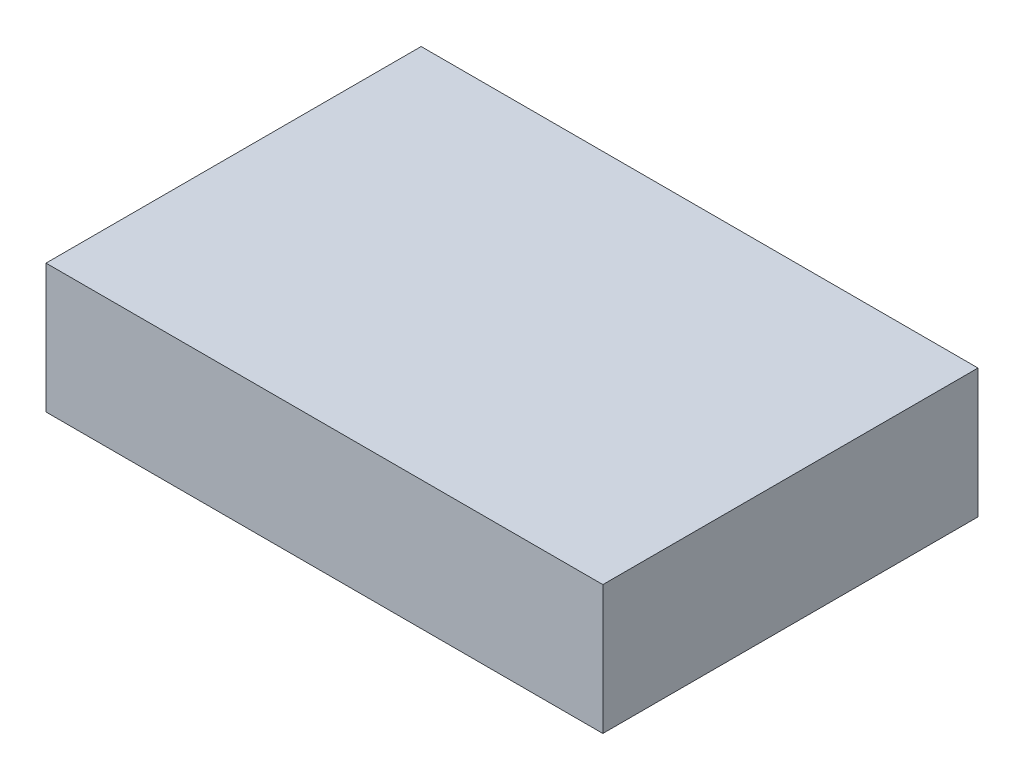
ISO-10303-21;
HEADER;
FILE_DESCRIPTION(('STEP AP214'),'2;1');
FILE_NAME('part.step','',(''),(''),'','','');
FILE_SCHEMA(('AUTOMOTIVE_DESIGN { 1 0 10303 214 1 1 1 1 }'));
ENDSEC;
DATA;
#1=APPLICATION_CONTEXT('core data for automotive mechanical design processes');
#2=APPLICATION_PROTOCOL_DEFINITION('international standard','automotive_design',2000,#1);
#3=PRODUCT_CONTEXT('',#1,'mechanical');
#4=PRODUCT('Part','Part','',(#3));
#5=PRODUCT_RELATED_PRODUCT_CATEGORY('part','',(#4));
#6=PRODUCT_DEFINITION_FORMATION('','',#4);
#7=PRODUCT_DEFINITION_CONTEXT('part definition',#1,'design');
#8=PRODUCT_DEFINITION('design','',#6,#7);
#9=PRODUCT_DEFINITION_SHAPE('','',#8);
#10=(LENGTH_UNIT() NAMED_UNIT(*) SI_UNIT(.MILLI.,.METRE.));
#11=(NAMED_UNIT(*) PLANE_ANGLE_UNIT() SI_UNIT($,.RADIAN.));
#12=(NAMED_UNIT(*) SI_UNIT($,.STERADIAN.) SOLID_ANGLE_UNIT());
#13=UNCERTAINTY_MEASURE_WITH_UNIT(LENGTH_MEASURE(1.E-05),#10,'distance_accuracy_value','');
#14=(GEOMETRIC_REPRESENTATION_CONTEXT(3) GLOBAL_UNCERTAINTY_ASSIGNED_CONTEXT((#13)) GLOBAL_UNIT_ASSIGNED_CONTEXT((#10,
#11,#12)) REPRESENTATION_CONTEXT('',''));
#15=CARTESIAN_POINT('',(0.,0.,0.));
#16=DIRECTION('',(0.,0.,1.));
#17=DIRECTION('',(1.,0.,0.));
#18=AXIS2_PLACEMENT_3D('',#15,#16,#17);
#19=CARTESIAN_POINT('',(47.5,22.,-32.));
#20=DIRECTION('',(-1.,0.,0.));
#21=DIRECTION('',(0.,0.,1.));
#22=AXIS2_PLACEMENT_3D('',#19,#20,#21);
#23=PLANE('',#22);
#24=DIRECTION('',(0.,0.,-1.));
#25=VECTOR('',#24,1.);
#26=CARTESIAN_POINT('',(47.5,0.,-32.));
#27=LINE('',#26,#25);
#28=CARTESIAN_POINT('',(47.5,0.,32.));
#29=VERTEX_POINT('',#28);
#30=CARTESIAN_POINT('',(47.5,0.,-32.));
#31=VERTEX_POINT('',#30);
#32=EDGE_CURVE('E111',#29,#31,#27,.T.);
#33=ORIENTED_EDGE('',*,*,#32,.T.);
#34=DIRECTION('',(0.,-1.,0.));
#35=VECTOR('',#34,1.);
#36=CARTESIAN_POINT('',(47.5,22.,-32.));
#37=LINE('',#36,#35);
#38=CARTESIAN_POINT('',(47.5,22.,-32.));
#39=VERTEX_POINT('',#38);
#40=EDGE_CURVE('E11',#39,#31,#37,.T.);
#41=ORIENTED_EDGE('',*,*,#40,.F.);
#42=DIRECTION('',(0.,0.,-1.));
#43=VECTOR('',#42,1.);
#44=CARTESIAN_POINT('',(47.5,22.,-32.));
#45=LINE('',#44,#43);
#46=CARTESIAN_POINT('',(47.5,22.,32.));
#47=VERTEX_POINT('',#46);
#48=EDGE_CURVE('E95',#47,#39,#45,.T.);
#49=ORIENTED_EDGE('',*,*,#48,.F.);
#50=DIRECTION('',(0.,-1.,0.));
#51=VECTOR('',#50,1.);
#52=CARTESIAN_POINT('',(47.5,22.,32.));
#53=LINE('',#52,#51);
#54=EDGE_CURVE('E107',#47,#29,#53,.T.);
#55=ORIENTED_EDGE('',*,*,#54,.T.);
#56=EDGE_LOOP('',(#33,#41,#49,#55));
#57=FACE_BOUND('',#56,.T.);
#58=ADVANCED_FACE('F43',(#57),#23,.F.);
#59=CARTESIAN_POINT('',(-47.5,22.,-32.));
#60=DIRECTION('',(0.,0.,1.));
#61=DIRECTION('',(1.,0.,0.));
#62=AXIS2_PLACEMENT_3D('',#59,#60,#61);
#63=PLANE('',#62);
#64=DIRECTION('',(-1.,0.,0.));
#65=VECTOR('',#64,1.);
#66=CARTESIAN_POINT('',(-47.5,0.,-32.));
#67=LINE('',#66,#65);
#68=CARTESIAN_POINT('',(-47.5,0.,-32.));
#69=VERTEX_POINT('',#68);
#70=EDGE_CURVE('E100',#31,#69,#67,.T.);
#71=ORIENTED_EDGE('',*,*,#70,.T.);
#72=DIRECTION('',(0.,-1.,0.));
#73=VECTOR('',#72,1.);
#74=CARTESIAN_POINT('',(-47.5,22.,-32.));
#75=LINE('',#74,#73);
#76=CARTESIAN_POINT('',(-47.5,22.,-32.));
#77=VERTEX_POINT('',#76);
#78=EDGE_CURVE('E52',#77,#69,#75,.T.);
#79=ORIENTED_EDGE('',*,*,#78,.F.);
#80=DIRECTION('',(-1.,0.,0.));
#81=VECTOR('',#80,1.);
#82=CARTESIAN_POINT('',(-47.5,22.,-32.));
#83=LINE('',#82,#81);
#84=EDGE_CURVE('E90',#39,#77,#83,.T.);
#85=ORIENTED_EDGE('',*,*,#84,.F.);
#86=ORIENTED_EDGE('',*,*,#40,.T.);
#87=EDGE_LOOP('',(#71,#79,#85,#86));
#88=FACE_BOUND('',#87,.T.);
#89=ADVANCED_FACE('F99',(#88),#63,.F.);
#90=CARTESIAN_POINT('',(-47.5,22.,-32.));
#91=DIRECTION('',(1.,0.,0.));
#92=DIRECTION('',(0.,0.,-1.));
#93=AXIS2_PLACEMENT_3D('',#90,#91,#92);
#94=PLANE('',#93);
#95=DIRECTION('',(0.,0.,1.));
#96=VECTOR('',#95,1.);
#97=CARTESIAN_POINT('',(-47.5,0.,-32.));
#98=LINE('',#97,#96);
#99=CARTESIAN_POINT('',(-47.5,0.,32.));
#100=VERTEX_POINT('',#99);
#101=EDGE_CURVE('E77',#69,#100,#98,.T.);
#102=ORIENTED_EDGE('',*,*,#101,.T.);
#103=DIRECTION('',(0.,-1.,0.));
#104=VECTOR('',#103,1.);
#105=CARTESIAN_POINT('',(-47.5,22.,32.));
#106=LINE('',#105,#104);
#107=CARTESIAN_POINT('',(-47.5,22.,32.));
#108=VERTEX_POINT('',#107);
#109=EDGE_CURVE('E102',#108,#100,#106,.T.);
#110=ORIENTED_EDGE('',*,*,#109,.F.);
#111=DIRECTION('',(0.,0.,1.));
#112=VECTOR('',#111,1.);
#113=CARTESIAN_POINT('',(-47.5,22.,-32.));
#114=LINE('',#113,#112);
#115=EDGE_CURVE('E93',#77,#108,#114,.T.);
#116=ORIENTED_EDGE('',*,*,#115,.F.);
#117=ORIENTED_EDGE('',*,*,#78,.T.);
#118=EDGE_LOOP('',(#102,#110,#116,#117));
#119=FACE_BOUND('',#118,.T.);
#120=ADVANCED_FACE('F103',(#119),#94,.F.);
#121=CARTESIAN_POINT('',(-47.5,22.,32.));
#122=DIRECTION('',(0.,0.,-1.));
#123=DIRECTION('',(-1.,0.,0.));
#124=AXIS2_PLACEMENT_3D('',#121,#122,#123);
#125=PLANE('',#124);
#126=DIRECTION('',(1.,0.,0.));
#127=VECTOR('',#126,1.);
#128=CARTESIAN_POINT('',(-47.5,0.,32.));
#129=LINE('',#128,#127);
#130=EDGE_CURVE('E83',#100,#29,#129,.T.);
#131=ORIENTED_EDGE('',*,*,#130,.T.);
#132=ORIENTED_EDGE('',*,*,#54,.F.);
#133=DIRECTION('',(1.,0.,0.));
#134=VECTOR('',#133,1.);
#135=CARTESIAN_POINT('',(-47.5,22.,32.));
#136=LINE('',#135,#134);
#137=EDGE_CURVE('E60',#108,#47,#136,.T.);
#138=ORIENTED_EDGE('',*,*,#137,.F.);
#139=ORIENTED_EDGE('',*,*,#109,.T.);
#140=EDGE_LOOP('',(#131,#132,#138,#139));
#141=FACE_BOUND('',#140,.T.);
#142=ADVANCED_FACE('F124',(#141),#125,.F.);
#143=CARTESIAN_POINT('',(0.,22.,0.));
#144=DIRECTION('',(0.,1.,0.));
#145=DIRECTION('',(0.,0.,1.));
#146=AXIS2_PLACEMENT_3D('',#143,#144,#145);
#147=PLANE('',#146);
#148=ORIENTED_EDGE('',*,*,#48,.T.);
#149=ORIENTED_EDGE('',*,*,#84,.T.);
#150=ORIENTED_EDGE('',*,*,#115,.T.);
#151=ORIENTED_EDGE('',*,*,#137,.T.);
#152=EDGE_LOOP('',(#148,#149,#150,#151));
#153=FACE_BOUND('',#152,.T.);
#154=ADVANCED_FACE('F91',(#153),#147,.T.);
#155=CARTESIAN_POINT('',(0.,0.,0.));
#156=DIRECTION('',(0.,1.,0.));
#157=DIRECTION('',(0.,0.,1.));
#158=AXIS2_PLACEMENT_3D('',#155,#156,#157);
#159=PLANE('',#158);
#160=ORIENTED_EDGE('',*,*,#32,.F.);
#161=ORIENTED_EDGE('',*,*,#130,.F.);
#162=ORIENTED_EDGE('',*,*,#101,.F.);
#163=ORIENTED_EDGE('',*,*,#70,.F.);
#164=EDGE_LOOP('',(#160,#161,#162,#163));
#165=FACE_BOUND('',#164,.T.);
#166=ADVANCED_FACE('F127',(#165),#159,.F.);
#167=CLOSED_SHELL('',(#58,#89,#120,#142,#154,#166));
#168=MANIFOLD_SOLID_BREP('B2',#167);
#169=ADVANCED_BREP_SHAPE_REPRESENTATION('',(#18,#168),#14);
#170=SHAPE_DEFINITION_REPRESENTATION(#9,#169);
ENDSEC;
END-ISO-10303-21;
